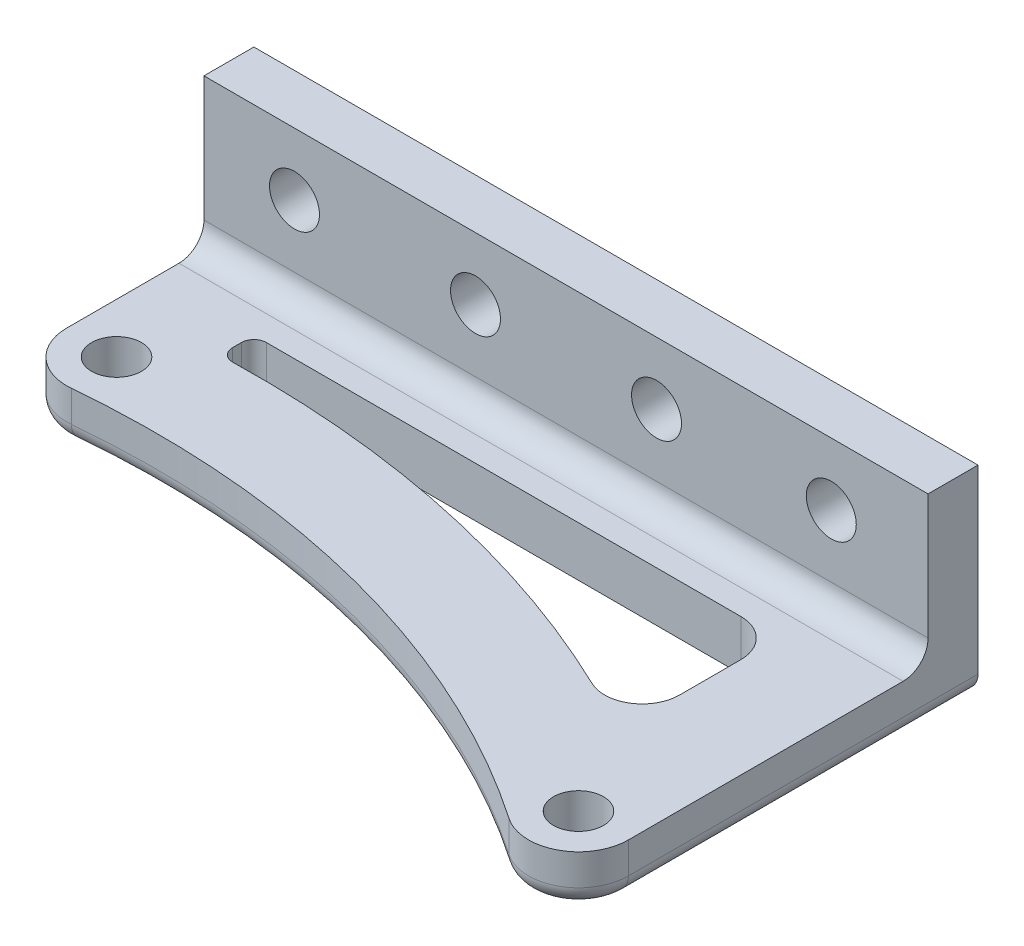
ISO-10303-21;
HEADER;
FILE_DESCRIPTION(('STEP AP214'),'2;1');
FILE_NAME('part.step','',(''),(''),'','','');
FILE_SCHEMA(('AUTOMOTIVE_DESIGN { 1 0 10303 214 1 1 1 1 }'));
ENDSEC;
DATA;
#1=APPLICATION_CONTEXT('core data for automotive mechanical design processes');
#2=APPLICATION_PROTOCOL_DEFINITION('international standard','automotive_design',2000,#1);
#3=PRODUCT_CONTEXT('',#1,'mechanical');
#4=PRODUCT('Part','Part','',(#3));
#5=PRODUCT_RELATED_PRODUCT_CATEGORY('part','',(#4));
#6=PRODUCT_DEFINITION_FORMATION('','',#4);
#7=PRODUCT_DEFINITION_CONTEXT('part definition',#1,'design');
#8=PRODUCT_DEFINITION('design','',#6,#7);
#9=PRODUCT_DEFINITION_SHAPE('','',#8);
#10=(LENGTH_UNIT() NAMED_UNIT(*) SI_UNIT(.MILLI.,.METRE.));
#11=(NAMED_UNIT(*) PLANE_ANGLE_UNIT() SI_UNIT($,.RADIAN.));
#12=(NAMED_UNIT(*) SI_UNIT($,.STERADIAN.) SOLID_ANGLE_UNIT());
#13=UNCERTAINTY_MEASURE_WITH_UNIT(LENGTH_MEASURE(1.E-05),#10,'distance_accuracy_value','');
#14=(GEOMETRIC_REPRESENTATION_CONTEXT(3) GLOBAL_UNCERTAINTY_ASSIGNED_CONTEXT((#13)) GLOBAL_UNIT_ASSIGNED_CONTEXT((#10,
#11,#12)) REPRESENTATION_CONTEXT('',''));
#15=CARTESIAN_POINT('',(0.,0.,0.));
#16=DIRECTION('',(0.,0.,1.));
#17=DIRECTION('',(1.,0.,0.));
#18=AXIS2_PLACEMENT_3D('',#15,#16,#17);
#19=CARTESIAN_POINT('',(-4.,4.,-28.));
#20=DIRECTION('',(0.,0.,1.));
#21=DIRECTION('',(1.,0.,0.));
#22=AXIS2_PLACEMENT_3D('',#19,#20,#21);
#23=PLANE('',#22);
#24=CARTESIAN_POINT('',(3.25,11.,-28.));
#25=DIRECTION('',(0.,0.,1.));
#26=DIRECTION('',(1.,0.,0.));
#27=AXIS2_PLACEMENT_3D('',#24,#25,#26);
#28=CIRCLE('',#27,2.);
#29=CARTESIAN_POINT('',(5.25,11.,-28.));
#30=VERTEX_POINT('',#29);
#31=EDGE_CURVE('E513',#30,#30,#28,.F.);
#32=ORIENTED_EDGE('',*,*,#31,.F.);
#33=EDGE_LOOP('',(#32));
#34=FACE_BOUND('',#33,.T.);
#35=CARTESIAN_POINT('',(17.75,11.,-28.));
#36=DIRECTION('',(0.,0.,1.));
#37=DIRECTION('',(1.,0.,0.));
#38=AXIS2_PLACEMENT_3D('',#35,#36,#37);
#39=CIRCLE('',#38,2.);
#40=CARTESIAN_POINT('',(19.75,11.,-28.));
#41=VERTEX_POINT('',#40);
#42=EDGE_CURVE('E199',#41,#41,#39,.F.);
#43=ORIENTED_EDGE('',*,*,#42,.F.);
#44=EDGE_LOOP('',(#43));
#45=FACE_BOUND('',#44,.T.);
#46=DIRECTION('',(0.,-1.,0.));
#47=VECTOR('',#46,1.);
#48=CARTESIAN_POINT('',(54.,4.,-28.));
#49=LINE('',#48,#47);
#50=CARTESIAN_POINT('',(54.,16.,-28.));
#51=VERTEX_POINT('',#50);
#52=CARTESIAN_POINT('',(54.,1.5,-28.));
#53=VERTEX_POINT('',#52);
#54=EDGE_CURVE('E183',#51,#53,#49,.T.);
#55=ORIENTED_EDGE('',*,*,#54,.T.);
#56=CARTESIAN_POINT('',(52.5,1.5,-28.));
#57=DIRECTION('',(0.,0.,1.));
#58=DIRECTION('',(1.,0.,0.));
#59=AXIS2_PLACEMENT_3D('',#56,#57,#58);
#60=CIRCLE('',#59,1.5);
#61=CARTESIAN_POINT('',(52.5,0.,-28.));
#62=VERTEX_POINT('',#61);
#63=EDGE_CURVE('E339',#53,#62,#60,.F.);
#64=ORIENTED_EDGE('',*,*,#63,.T.);
#65=DIRECTION('',(-1.,0.,0.));
#66=VECTOR('',#65,1.);
#67=CARTESIAN_POINT('',(-4.,0.,-28.));
#68=LINE('',#67,#66);
#69=CARTESIAN_POINT('',(-2.5,0.,-28.));
#70=VERTEX_POINT('',#69);
#71=EDGE_CURVE('E284',#62,#70,#68,.T.);
#72=ORIENTED_EDGE('',*,*,#71,.T.);
#73=CARTESIAN_POINT('',(-2.5,1.5,-28.));
#74=DIRECTION('',(0.,0.,1.));
#75=DIRECTION('',(1.,0.,0.));
#76=AXIS2_PLACEMENT_3D('',#73,#74,#75);
#77=CIRCLE('',#76,1.5);
#78=CARTESIAN_POINT('',(-4.,1.5,-28.));
#79=VERTEX_POINT('',#78);
#80=EDGE_CURVE('E181',#70,#79,#77,.F.);
#81=ORIENTED_EDGE('',*,*,#80,.T.);
#82=DIRECTION('',(0.,-1.,0.));
#83=VECTOR('',#82,1.);
#84=CARTESIAN_POINT('',(-4.,4.,-28.));
#85=LINE('',#84,#83);
#86=CARTESIAN_POINT('',(-4.,16.,-28.));
#87=VERTEX_POINT('',#86);
#88=EDGE_CURVE('E174',#87,#79,#85,.T.);
#89=ORIENTED_EDGE('',*,*,#88,.F.);
#90=DIRECTION('',(-1.,0.,0.));
#91=VECTOR('',#90,1.);
#92=CARTESIAN_POINT('',(54.,16.,-28.));
#93=LINE('',#92,#91);
#94=EDGE_CURVE('E179',#51,#87,#93,.T.);
#95=ORIENTED_EDGE('',*,*,#94,.F.);
#96=EDGE_LOOP('',(#55,#64,#72,#81,#89,#95));
#97=FACE_BOUND('',#96,.T.);
#98=CARTESIAN_POINT('',(32.25,11.,-28.));
#99=DIRECTION('',(0.,0.,1.));
#100=DIRECTION('',(1.,0.,0.));
#101=AXIS2_PLACEMENT_3D('',#98,#99,#100);
#102=CIRCLE('',#101,2.);
#103=CARTESIAN_POINT('',(34.25,11.,-28.));
#104=VERTEX_POINT('',#103);
#105=EDGE_CURVE('E498',#104,#104,#102,.T.);
#106=ORIENTED_EDGE('',*,*,#105,.T.);
#107=EDGE_LOOP('',(#106));
#108=FACE_BOUND('',#107,.T.);
#109=CARTESIAN_POINT('',(46.25,11.,-28.));
#110=DIRECTION('',(0.,0.,1.));
#111=DIRECTION('',(1.,0.,0.));
#112=AXIS2_PLACEMENT_3D('',#109,#110,#111);
#113=CIRCLE('',#112,2.);
#114=CARTESIAN_POINT('',(48.25,11.,-28.));
#115=VERTEX_POINT('',#114);
#116=EDGE_CURVE('E507',#115,#115,#113,.T.);
#117=ORIENTED_EDGE('',*,*,#116,.T.);
#118=EDGE_LOOP('',(#117));
#119=FACE_BOUND('',#118,.T.);
#120=ADVANCED_FACE('F38',(#34,#45,#97,#108,#119),#23,.F.);
#121=CARTESIAN_POINT('',(-4.,16.,-24.));
#122=DIRECTION('',(0.,0.,-1.));
#123=DIRECTION('',(-1.,0.,0.));
#124=AXIS2_PLACEMENT_3D('',#121,#122,#123);
#125=PLANE('',#124);
#126=CARTESIAN_POINT('',(3.25,11.,-24.));
#127=DIRECTION('',(0.,0.,1.));
#128=DIRECTION('',(1.,0.,0.));
#129=AXIS2_PLACEMENT_3D('',#126,#127,#128);
#130=CIRCLE('',#129,2.);
#131=CARTESIAN_POINT('',(5.25,11.,-24.));
#132=VERTEX_POINT('',#131);
#133=EDGE_CURVE('E510',#132,#132,#130,.T.);
#134=ORIENTED_EDGE('',*,*,#133,.F.);
#135=EDGE_LOOP('',(#134));
#136=FACE_BOUND('',#135,.T.);
#137=CARTESIAN_POINT('',(17.75,11.,-24.));
#138=DIRECTION('',(0.,0.,1.));
#139=DIRECTION('',(1.,0.,0.));
#140=AXIS2_PLACEMENT_3D('',#137,#138,#139);
#141=CIRCLE('',#140,2.);
#142=CARTESIAN_POINT('',(19.75,11.,-24.));
#143=VERTEX_POINT('',#142);
#144=EDGE_CURVE('E202',#143,#143,#141,.T.);
#145=ORIENTED_EDGE('',*,*,#144,.F.);
#146=EDGE_LOOP('',(#145));
#147=FACE_BOUND('',#146,.T.);
#148=DIRECTION('',(0.,-1.,0.));
#149=VECTOR('',#148,1.);
#150=CARTESIAN_POINT('',(-4.,16.,-24.));
#151=LINE('',#150,#149);
#152=CARTESIAN_POINT('',(-4.,16.,-24.));
#153=VERTEX_POINT('',#152);
#154=CARTESIAN_POINT('',(-4.,6.,-24.));
#155=VERTEX_POINT('',#154);
#156=EDGE_CURVE('E190',#153,#155,#151,.T.);
#157=ORIENTED_EDGE('',*,*,#156,.T.);
#158=DIRECTION('',(1.,0.,0.));
#159=VECTOR('',#158,1.);
#160=CARTESIAN_POINT('',(-4.,6.,-24.));
#161=LINE('',#160,#159);
#162=CARTESIAN_POINT('',(54.,6.,-24.));
#163=VERTEX_POINT('',#162);
#164=EDGE_CURVE('E310',#155,#163,#161,.T.);
#165=ORIENTED_EDGE('',*,*,#164,.T.);
#166=DIRECTION('',(0.,-1.,0.));
#167=VECTOR('',#166,1.);
#168=CARTESIAN_POINT('',(54.,16.,-24.));
#169=LINE('',#168,#167);
#170=CARTESIAN_POINT('',(54.,16.,-24.));
#171=VERTEX_POINT('',#170);
#172=EDGE_CURVE('E208',#171,#163,#169,.T.);
#173=ORIENTED_EDGE('',*,*,#172,.F.);
#174=DIRECTION('',(1.,0.,0.));
#175=VECTOR('',#174,1.);
#176=CARTESIAN_POINT('',(-4.,16.,-24.));
#177=LINE('',#176,#175);
#178=EDGE_CURVE('E193',#153,#171,#177,.T.);
#179=ORIENTED_EDGE('',*,*,#178,.F.);
#180=EDGE_LOOP('',(#157,#165,#173,#179));
#181=FACE_BOUND('',#180,.T.);
#182=CARTESIAN_POINT('',(32.25,11.,-24.));
#183=DIRECTION('',(0.,0.,1.));
#184=DIRECTION('',(1.,0.,0.));
#185=AXIS2_PLACEMENT_3D('',#182,#183,#184);
#186=CIRCLE('',#185,2.);
#187=CARTESIAN_POINT('',(34.25,11.,-24.));
#188=VERTEX_POINT('',#187);
#189=EDGE_CURVE('E501',#188,#188,#186,.F.);
#190=ORIENTED_EDGE('',*,*,#189,.T.);
#191=EDGE_LOOP('',(#190));
#192=FACE_BOUND('',#191,.T.);
#193=CARTESIAN_POINT('',(46.25,11.,-24.));
#194=DIRECTION('',(0.,0.,1.));
#195=DIRECTION('',(1.,0.,0.));
#196=AXIS2_PLACEMENT_3D('',#193,#194,#195);
#197=CIRCLE('',#196,2.);
#198=CARTESIAN_POINT('',(48.25,11.,-24.));
#199=VERTEX_POINT('',#198);
#200=EDGE_CURVE('E504',#199,#199,#197,.F.);
#201=ORIENTED_EDGE('',*,*,#200,.T.);
#202=EDGE_LOOP('',(#201));
#203=FACE_BOUND('',#202,.T.);
#204=ADVANCED_FACE('F391',(#136,#147,#181,#192,#203),#125,.F.);
#205=CARTESIAN_POINT('',(0.,1.5,-13.));
#206=DIRECTION('',(0.,1.,0.));
#207=DIRECTION('',(0.,0.,1.));
#208=AXIS2_PLACEMENT_3D('',#205,#206,#207);
#209=TOROIDAL_SURFACE('',#208,2.5,1.5);
#210=CARTESIAN_POINT('',(-2.5,1.5,-13.));
#211=DIRECTION('',(0.,0.,-1.));
#212=DIRECTION('',(-1.,0.,0.));
#213=AXIS2_PLACEMENT_3D('',#210,#211,#212);
#214=CIRCLE('',#213,1.5);
#215=CARTESIAN_POINT('',(-2.5,0.,-13.));
#216=VERTEX_POINT('',#215);
#217=CARTESIAN_POINT('',(-4.,1.5,-13.));
#218=VERTEX_POINT('',#217);
#219=EDGE_CURVE('E11',#216,#218,#214,.T.);
#220=ORIENTED_EDGE('',*,*,#219,.F.);
#221=CARTESIAN_POINT('',(0.,0.,-13.));
#222=DIRECTION('',(0.,1.,0.));
#223=DIRECTION('',(0.,0.,1.));
#224=AXIS2_PLACEMENT_3D('',#221,#222,#223);
#225=CIRCLE('',#224,2.5);
#226=CARTESIAN_POINT('',(0.225630994390622,0.,-10.5102026880948));
#227=VERTEX_POINT('',#226);
#228=EDGE_CURVE('E323',#227,#216,#225,.F.);
#229=ORIENTED_EDGE('',*,*,#228,.F.);
#230=CARTESIAN_POINT('',(0.225630994390629,1.5,-10.5102026880948));
#231=DIRECTION('',(-0.995918924762076,0.,0.090252397756244));
#232=DIRECTION('',(0.090252397756244,0.,0.995918924762076));
#233=AXIS2_PLACEMENT_3D('',#230,#231,#232);
#234=CIRCLE('',#233,1.5);
#235=CARTESIAN_POINT('',(0.361009591024995,1.5,-9.0163243009517));
#236=VERTEX_POINT('',#235);
#237=EDGE_CURVE('E46',#227,#236,#234,.T.);
#238=ORIENTED_EDGE('',*,*,#237,.T.);
#239=CARTESIAN_POINT('',(0.,1.5,-13.));
#240=DIRECTION('',(0.,1.,0.));
#241=DIRECTION('',(0.,0.,1.));
#242=AXIS2_PLACEMENT_3D('',#239,#240,#241);
#243=CIRCLE('',#242,4.);
#244=EDGE_CURVE('E347',#218,#236,#243,.T.);
#245=ORIENTED_EDGE('',*,*,#244,.F.);
#246=EDGE_LOOP('',(#220,#229,#238,#245));
#247=FACE_BOUND('',#246,.T.);
#248=ADVANCED_FACE('F380',(#247),#209,.T.);
#249=CARTESIAN_POINT('',(6.89832871152092,1.5,63.1218126479964));
#250=DIRECTION('',(0.,1.,0.));
#251=DIRECTION('',(0.,0.,1.));
#252=AXIS2_PLACEMENT_3D('',#249,#250,#251);
#253=TOROIDAL_SURFACE('',#252,73.9337445100583,1.5);
#254=ORIENTED_EDGE('',*,*,#237,.F.);
#255=CARTESIAN_POINT('',(6.89832871152092,0.,63.1218126479964));
#256=DIRECTION('',(0.,1.,0.));
#257=DIRECTION('',(0.,0.,1.));
#258=AXIS2_PLACEMENT_3D('',#255,#256,#257);
#259=CIRCLE('',#258,73.9337445100583);
#260=CARTESIAN_POINT('',(48.5902276682648,0.,2.06459244711248));
#261=VERTEX_POINT('',#260);
#262=EDGE_CURVE('E326',#261,#227,#259,.T.);
#263=ORIENTED_EDGE('',*,*,#262,.F.);
#264=CARTESIAN_POINT('',(48.5902276682648,1.5,2.06459244711248));
#265=DIRECTION('',(-0.825836978844991,0.,-0.563908932694082));
#266=DIRECTION('',(-0.563908932694082,0.,0.825836978844991));
#267=AXIS2_PLACEMENT_3D('',#264,#265,#266);
#268=CIRCLE('',#267,1.5);
#269=CARTESIAN_POINT('',(47.7443642692237,1.5,3.30334791537996));
#270=VERTEX_POINT('',#269);
#271=EDGE_CURVE('E353',#261,#270,#268,.T.);
#272=ORIENTED_EDGE('',*,*,#271,.T.);
#273=CARTESIAN_POINT('',(6.89832871152092,1.5,63.1218126479964));
#274=DIRECTION('',(0.,1.,0.));
#275=DIRECTION('',(0.,0.,1.));
#276=AXIS2_PLACEMENT_3D('',#273,#274,#275);
#277=CIRCLE('',#276,72.4337445100582);
#278=EDGE_CURVE('E344',#236,#270,#277,.F.);
#279=ORIENTED_EDGE('',*,*,#278,.F.);
#280=EDGE_LOOP('',(#254,#263,#272,#279));
#281=FACE_BOUND('',#280,.T.);
#282=ADVANCED_FACE('F357',(#281),#253,.T.);
#283=CARTESIAN_POINT('',(50.,1.5,0.));
#284=DIRECTION('',(0.,1.,0.));
#285=DIRECTION('',(0.,0.,1.));
#286=AXIS2_PLACEMENT_3D('',#283,#284,#285);
#287=TOROIDAL_SURFACE('',#286,2.50000000000001,1.5);
#288=ORIENTED_EDGE('',*,*,#271,.F.);
#289=CARTESIAN_POINT('',(50.,0.,0.));
#290=DIRECTION('',(0.,1.,0.));
#291=DIRECTION('',(0.,0.,1.));
#292=AXIS2_PLACEMENT_3D('',#289,#290,#291);
#293=CIRCLE('',#292,2.50000000000001);
#294=CARTESIAN_POINT('',(52.5,0.,0.));
#295=VERTEX_POINT('',#294);
#296=EDGE_CURVE('E329',#295,#261,#293,.F.);
#297=ORIENTED_EDGE('',*,*,#296,.F.);
#298=CARTESIAN_POINT('',(52.5,1.5,0.));
#299=DIRECTION('',(0.,0.,1.));
#300=DIRECTION('',(1.,0.,0.));
#301=AXIS2_PLACEMENT_3D('',#298,#299,#300);
#302=CIRCLE('',#301,1.5);
#303=CARTESIAN_POINT('',(54.,1.5,0.));
#304=VERTEX_POINT('',#303);
#305=EDGE_CURVE('E351',#295,#304,#302,.T.);
#306=ORIENTED_EDGE('',*,*,#305,.T.);
#307=CARTESIAN_POINT('',(50.,1.5,0.));
#308=DIRECTION('',(0.,1.,0.));
#309=DIRECTION('',(0.,0.,1.));
#310=AXIS2_PLACEMENT_3D('',#307,#308,#309);
#311=CIRCLE('',#310,4.00000000000001);
#312=EDGE_CURVE('E341',#270,#304,#311,.T.);
#313=ORIENTED_EDGE('',*,*,#312,.F.);
#314=EDGE_LOOP('',(#288,#297,#306,#313));
#315=FACE_BOUND('',#314,.T.);
#316=ADVANCED_FACE('F366',(#315),#287,.T.);
#317=CARTESIAN_POINT('',(52.5,1.5,-13.));
#318=DIRECTION('',(0.,0.,1.));
#319=DIRECTION('',(1.,0.,0.));
#320=AXIS2_PLACEMENT_3D('',#317,#318,#319);
#321=CYLINDRICAL_SURFACE('',#320,1.5);
#322=ORIENTED_EDGE('',*,*,#305,.F.);
#323=DIRECTION('',(0.,0.,1.));
#324=VECTOR('',#323,1.);
#325=CARTESIAN_POINT('',(52.5,0.,-13.));
#326=LINE('',#325,#324);
#327=EDGE_CURVE('E332',#62,#295,#326,.T.);
#328=ORIENTED_EDGE('',*,*,#327,.F.);
#329=ORIENTED_EDGE('',*,*,#63,.F.);
#330=DIRECTION('',(0.,0.,1.));
#331=VECTOR('',#330,1.);
#332=CARTESIAN_POINT('',(54.,1.5,-28.));
#333=LINE('',#332,#331);
#334=EDGE_CURVE('E335',#304,#53,#333,.F.);
#335=ORIENTED_EDGE('',*,*,#334,.F.);
#336=EDGE_LOOP('',(#322,#328,#329,#335));
#337=FACE_BOUND('',#336,.T.);
#338=ADVANCED_FACE('F397',(#337),#321,.T.);
#339=CARTESIAN_POINT('',(-2.5,1.5,-13.));
#340=DIRECTION('',(0.,0.,-1.));
#341=DIRECTION('',(-1.,0.,0.));
#342=AXIS2_PLACEMENT_3D('',#339,#340,#341);
#343=CYLINDRICAL_SURFACE('',#342,1.5);
#344=DIRECTION('',(0.,0.,-1.));
#345=VECTOR('',#344,1.);
#346=CARTESIAN_POINT('',(-2.5,0.,-13.));
#347=LINE('',#346,#345);
#348=EDGE_CURVE('E320',#216,#70,#347,.T.);
#349=ORIENTED_EDGE('',*,*,#348,.F.);
#350=ORIENTED_EDGE('',*,*,#219,.T.);
#351=DIRECTION('',(0.,0.,-1.));
#352=VECTOR('',#351,1.);
#353=CARTESIAN_POINT('',(-4.,1.5,-13.));
#354=LINE('',#353,#352);
#355=EDGE_CURVE('E349',#79,#218,#354,.F.);
#356=ORIENTED_EDGE('',*,*,#355,.F.);
#357=ORIENTED_EDGE('',*,*,#80,.F.);
#358=EDGE_LOOP('',(#349,#350,#356,#357));
#359=FACE_BOUND('',#358,.T.);
#360=ADVANCED_FACE('F40',(#359),#343,.T.);
#361=CARTESIAN_POINT('',(-4.,6.,-22.));
#362=DIRECTION('',(1.,0.,0.));
#363=DIRECTION('',(0.,0.,-1.));
#364=AXIS2_PLACEMENT_3D('',#361,#362,#363);
#365=CYLINDRICAL_SURFACE('',#364,2.);
#366=ORIENTED_EDGE('',*,*,#164,.F.);
#367=CARTESIAN_POINT('',(-4.,6.,-22.));
#368=DIRECTION('',(1.,0.,0.));
#369=DIRECTION('',(0.,0.,-1.));
#370=AXIS2_PLACEMENT_3D('',#367,#368,#369);
#371=CIRCLE('',#370,2.);
#372=CARTESIAN_POINT('',(-4.,4.,-22.));
#373=VERTEX_POINT('',#372);
#374=EDGE_CURVE('E316',#155,#373,#371,.F.);
#375=ORIENTED_EDGE('',*,*,#374,.T.);
#376=DIRECTION('',(1.,0.,0.));
#377=VECTOR('',#376,1.);
#378=CARTESIAN_POINT('',(0.,4.,-22.));
#379=LINE('',#378,#377);
#380=CARTESIAN_POINT('',(54.,4.,-22.));
#381=VERTEX_POINT('',#380);
#382=EDGE_CURVE('E313',#381,#373,#379,.F.);
#383=ORIENTED_EDGE('',*,*,#382,.F.);
#384=CARTESIAN_POINT('',(54.,6.,-22.));
#385=DIRECTION('',(-1.,0.,0.));
#386=DIRECTION('',(0.,0.,1.));
#387=AXIS2_PLACEMENT_3D('',#384,#385,#386);
#388=CIRCLE('',#387,2.);
#389=EDGE_CURVE('E318',#381,#163,#388,.F.);
#390=ORIENTED_EDGE('',*,*,#389,.T.);
#391=EDGE_LOOP('',(#366,#375,#383,#390));
#392=FACE_BOUND('',#391,.T.);
#393=ADVANCED_FACE('F388',(#392),#365,.F.);
#394=CARTESIAN_POINT('',(0.,4.,-13.));
#395=DIRECTION('',(0.,1.,0.));
#396=DIRECTION('',(0.,0.,1.));
#397=AXIS2_PLACEMENT_3D('',#394,#395,#396);
#398=PLANE('',#397);
#399=DIRECTION('',(0.,0.,-1.));
#400=VECTOR('',#399,1.);
#401=CARTESIAN_POINT('',(54.,4.,-28.));
#402=LINE('',#401,#400);
#403=CARTESIAN_POINT('',(54.,4.,0.));
#404=VERTEX_POINT('',#403);
#405=EDGE_CURVE('E292',#404,#381,#402,.T.);
#406=ORIENTED_EDGE('',*,*,#405,.T.);
#407=ORIENTED_EDGE('',*,*,#382,.T.);
#408=DIRECTION('',(0.,0.,1.));
#409=VECTOR('',#408,1.);
#410=CARTESIAN_POINT('',(-4.,4.,-13.));
#411=LINE('',#410,#409);
#412=CARTESIAN_POINT('',(-4.,4.,-13.));
#413=VERTEX_POINT('',#412);
#414=EDGE_CURVE('E295',#373,#413,#411,.T.);
#415=ORIENTED_EDGE('',*,*,#414,.T.);
#416=CARTESIAN_POINT('',(0.,4.,-13.));
#417=DIRECTION('',(0.,1.,0.));
#418=DIRECTION('',(0.,0.,1.));
#419=AXIS2_PLACEMENT_3D('',#416,#417,#418);
#420=CIRCLE('',#419,4.);
#421=CARTESIAN_POINT('',(0.361009591024995,4.,-9.0163243009517));
#422=VERTEX_POINT('',#421);
#423=EDGE_CURVE('E285',#413,#422,#420,.T.);
#424=ORIENTED_EDGE('',*,*,#423,.T.);
#425=CARTESIAN_POINT('',(6.89832871152092,4.,63.1218126479964));
#426=DIRECTION('',(0.,-1.,0.));
#427=DIRECTION('',(0.,0.,1.));
#428=AXIS2_PLACEMENT_3D('',#425,#426,#427);
#429=CIRCLE('',#428,72.4337445100582);
#430=CARTESIAN_POINT('',(47.7443642692237,4.,3.30334791537996));
#431=VERTEX_POINT('',#430);
#432=EDGE_CURVE('E288',#422,#431,#429,.T.);
#433=ORIENTED_EDGE('',*,*,#432,.T.);
#434=CARTESIAN_POINT('',(50.,4.,0.));
#435=DIRECTION('',(0.,1.,0.));
#436=DIRECTION('',(0.,0.,1.));
#437=AXIS2_PLACEMENT_3D('',#434,#435,#436);
#438=CIRCLE('',#437,4.00000000000001);
#439=EDGE_CURVE('E290',#431,#404,#438,.T.);
#440=ORIENTED_EDGE('',*,*,#439,.T.);
#441=EDGE_LOOP('',(#406,#407,#415,#424,#433,#440));
#442=FACE_BOUND('',#441,.T.);
#443=CARTESIAN_POINT('',(0.,4.,-13.));
#444=DIRECTION('',(0.,1.,0.));
#445=DIRECTION('',(0.,0.,1.));
#446=AXIS2_PLACEMENT_3D('',#443,#444,#445);
#447=CIRCLE('',#446,2.);
#448=CARTESIAN_POINT('',(0.,4.,-11.));
#449=VERTEX_POINT('',#448);
#450=EDGE_CURVE('E219',#449,#449,#447,.T.);
#451=ORIENTED_EDGE('',*,*,#450,.F.);
#452=EDGE_LOOP('',(#451));
#453=FACE_BOUND('',#452,.T.);
#454=CARTESIAN_POINT('',(43.,4.,-12.0969287210818));
#455=DIRECTION('',(0.,1.,0.));
#456=DIRECTION('',(0.,0.,-1.));
#457=AXIS2_PLACEMENT_3D('',#454,#455,#456);
#458=CIRCLE('',#457,3.00000000000001);
#459=CARTESIAN_POINT('',(41.7019039538327,4.,-9.3923129156623));
#460=VERTEX_POINT('',#459);
#461=CARTESIAN_POINT('',(46.,4.,-12.0969287210818));
#462=VERTEX_POINT('',#461);
#463=EDGE_CURVE('E227',#460,#462,#458,.T.);
#464=ORIENTED_EDGE('',*,*,#463,.F.);
#465=CARTESIAN_POINT('',(6.89832871152092,4.,63.1218126479964));
#466=DIRECTION('',(0.,-1.,0.));
#467=DIRECTION('',(0.,0.,1.));
#468=AXIS2_PLACEMENT_3D('',#465,#466,#467);
#469=CIRCLE('',#468,80.4337445100582);
#470=CARTESIAN_POINT('',(5.02331132779098,4.,-17.2900743197898));
#471=VERTEX_POINT('',#470);
#472=EDGE_CURVE('E225',#471,#460,#469,.T.);
#473=ORIENTED_EDGE('',*,*,#472,.F.);
#474=CARTESIAN_POINT('',(5.,4.,-18.2898025738652));
#475=DIRECTION('',(0.,1.,0.));
#476=DIRECTION('',(0.,0.,-1.));
#477=AXIS2_PLACEMENT_3D('',#474,#475,#476);
#478=CIRCLE('',#477,1.);
#479=CARTESIAN_POINT('',(4.,4.,-18.2898025738652));
#480=VERTEX_POINT('',#479);
#481=EDGE_CURVE('E241',#480,#471,#478,.T.);
#482=ORIENTED_EDGE('',*,*,#481,.F.);
#483=DIRECTION('',(0.,0.,1.));
#484=VECTOR('',#483,1.);
#485=CARTESIAN_POINT('',(4.,4.,-18.2898025738652));
#486=LINE('',#485,#484);
#487=CARTESIAN_POINT('',(4.,4.,-19.));
#488=VERTEX_POINT('',#487);
#489=EDGE_CURVE('E238',#488,#480,#486,.T.);
#490=ORIENTED_EDGE('',*,*,#489,.F.);
#491=CARTESIAN_POINT('',(5.,4.,-19.));
#492=DIRECTION('',(0.,1.,0.));
#493=DIRECTION('',(0.,0.,1.));
#494=AXIS2_PLACEMENT_3D('',#491,#492,#493);
#495=CIRCLE('',#494,1.);
#496=CARTESIAN_POINT('',(5.00000000000001,4.,-20.));
#497=VERTEX_POINT('',#496);
#498=EDGE_CURVE('E236',#497,#488,#495,.T.);
#499=ORIENTED_EDGE('',*,*,#498,.F.);
#500=DIRECTION('',(-1.,0.,0.));
#501=VECTOR('',#500,1.);
#502=CARTESIAN_POINT('',(25.,4.,-20.));
#503=LINE('',#502,#501);
#504=CARTESIAN_POINT('',(43.,4.,-20.));
#505=VERTEX_POINT('',#504);
#506=EDGE_CURVE('E234',#505,#497,#503,.T.);
#507=ORIENTED_EDGE('',*,*,#506,.F.);
#508=CARTESIAN_POINT('',(43.,4.,-17.));
#509=DIRECTION('',(0.,1.,0.));
#510=DIRECTION('',(0.,0.,1.));
#511=AXIS2_PLACEMENT_3D('',#508,#509,#510);
#512=CIRCLE('',#511,3.);
#513=CARTESIAN_POINT('',(46.,4.,-17.));
#514=VERTEX_POINT('',#513);
#515=EDGE_CURVE('E232',#514,#505,#512,.T.);
#516=ORIENTED_EDGE('',*,*,#515,.F.);
#517=DIRECTION('',(0.,0.,-1.));
#518=VECTOR('',#517,1.);
#519=CARTESIAN_POINT('',(46.,4.,-12.0969287210818));
#520=LINE('',#519,#518);
#521=EDGE_CURVE('E230',#462,#514,#520,.T.);
#522=ORIENTED_EDGE('',*,*,#521,.F.);
#523=EDGE_LOOP('',(#464,#473,#482,#490,#499,#507,#516,#522));
#524=FACE_BOUND('',#523,.T.);
#525=CARTESIAN_POINT('',(50.,4.,0.));
#526=DIRECTION('',(0.,1.,0.));
#527=DIRECTION('',(0.,0.,1.));
#528=AXIS2_PLACEMENT_3D('',#525,#526,#527);
#529=CIRCLE('',#528,2.);
#530=CARTESIAN_POINT('',(50.,4.,2.));
#531=VERTEX_POINT('',#530);
#532=EDGE_CURVE('E213',#531,#531,#529,.T.);
#533=ORIENTED_EDGE('',*,*,#532,.F.);
#534=EDGE_LOOP('',(#533));
#535=FACE_BOUND('',#534,.T.);
#536=ADVANCED_FACE('F373',(#442,#453,#524,#535),#398,.T.);
#537=CARTESIAN_POINT('',(0.,0.,-13.));
#538=DIRECTION('',(0.,1.,0.));
#539=DIRECTION('',(0.,0.,1.));
#540=AXIS2_PLACEMENT_3D('',#537,#538,#539);
#541=PLANE('',#540);
#542=ORIENTED_EDGE('',*,*,#71,.F.);
#543=ORIENTED_EDGE('',*,*,#327,.T.);
#544=ORIENTED_EDGE('',*,*,#296,.T.);
#545=ORIENTED_EDGE('',*,*,#262,.T.);
#546=ORIENTED_EDGE('',*,*,#228,.T.);
#547=ORIENTED_EDGE('',*,*,#348,.T.);
#548=EDGE_LOOP('',(#542,#543,#544,#545,#546,#547));
#549=FACE_BOUND('',#548,.T.);
#550=CARTESIAN_POINT('',(6.89832871152092,0.,63.1218126479964));
#551=DIRECTION('',(0.,-1.,0.));
#552=DIRECTION('',(0.,0.,1.));
#553=AXIS2_PLACEMENT_3D('',#550,#551,#552);
#554=CIRCLE('',#553,80.4337445100582);
#555=CARTESIAN_POINT('',(5.02331132779098,0.,-17.2900743197898));
#556=VERTEX_POINT('',#555);
#557=CARTESIAN_POINT('',(41.7019039538327,0.,-9.3923129156623));
#558=VERTEX_POINT('',#557);
#559=EDGE_CURVE('E222',#556,#558,#554,.T.);
#560=ORIENTED_EDGE('',*,*,#559,.T.);
#561=CARTESIAN_POINT('',(43.,0.,-12.0969287210818));
#562=DIRECTION('',(0.,1.,0.));
#563=DIRECTION('',(0.,0.,-1.));
#564=AXIS2_PLACEMENT_3D('',#561,#562,#563);
#565=CIRCLE('',#564,3.00000000000001);
#566=CARTESIAN_POINT('',(46.,0.,-12.0969287210818));
#567=VERTEX_POINT('',#566);
#568=EDGE_CURVE('E246',#558,#567,#565,.T.);
#569=ORIENTED_EDGE('',*,*,#568,.T.);
#570=DIRECTION('',(0.,0.,-1.));
#571=VECTOR('',#570,1.);
#572=CARTESIAN_POINT('',(46.,0.,-12.0969287210818));
#573=LINE('',#572,#571);
#574=CARTESIAN_POINT('',(46.,0.,-17.));
#575=VERTEX_POINT('',#574);
#576=EDGE_CURVE('E249',#567,#575,#573,.T.);
#577=ORIENTED_EDGE('',*,*,#576,.T.);
#578=CARTESIAN_POINT('',(43.,0.,-17.));
#579=DIRECTION('',(0.,1.,0.));
#580=DIRECTION('',(0.,0.,1.));
#581=AXIS2_PLACEMENT_3D('',#578,#579,#580);
#582=CIRCLE('',#581,3.);
#583=CARTESIAN_POINT('',(43.,0.,-20.));
#584=VERTEX_POINT('',#583);
#585=EDGE_CURVE('E252',#575,#584,#582,.T.);
#586=ORIENTED_EDGE('',*,*,#585,.T.);
#587=DIRECTION('',(-1.,0.,0.));
#588=VECTOR('',#587,1.);
#589=CARTESIAN_POINT('',(25.,0.,-20.));
#590=LINE('',#589,#588);
#591=CARTESIAN_POINT('',(5.00000000000001,0.,-20.));
#592=VERTEX_POINT('',#591);
#593=EDGE_CURVE('E255',#584,#592,#590,.T.);
#594=ORIENTED_EDGE('',*,*,#593,.T.);
#595=CARTESIAN_POINT('',(5.,0.,-19.));
#596=DIRECTION('',(0.,1.,0.));
#597=DIRECTION('',(0.,0.,1.));
#598=AXIS2_PLACEMENT_3D('',#595,#596,#597);
#599=CIRCLE('',#598,1.);
#600=CARTESIAN_POINT('',(4.,0.,-19.));
#601=VERTEX_POINT('',#600);
#602=EDGE_CURVE('E258',#592,#601,#599,.T.);
#603=ORIENTED_EDGE('',*,*,#602,.T.);
#604=DIRECTION('',(0.,0.,1.));
#605=VECTOR('',#604,1.);
#606=CARTESIAN_POINT('',(4.,0.,-18.2898025738652));
#607=LINE('',#606,#605);
#608=CARTESIAN_POINT('',(4.,0.,-18.2898025738652));
#609=VERTEX_POINT('',#608);
#610=EDGE_CURVE('E261',#601,#609,#607,.T.);
#611=ORIENTED_EDGE('',*,*,#610,.T.);
#612=CARTESIAN_POINT('',(5.,0.,-18.2898025738652));
#613=DIRECTION('',(0.,1.,0.));
#614=DIRECTION('',(0.,0.,-1.));
#615=AXIS2_PLACEMENT_3D('',#612,#613,#614);
#616=CIRCLE('',#615,1.);
#617=EDGE_CURVE('E228',#609,#556,#616,.T.);
#618=ORIENTED_EDGE('',*,*,#617,.T.);
#619=EDGE_LOOP('',(#560,#569,#577,#586,#594,#603,#611,#618));
#620=FACE_BOUND('',#619,.T.);
#621=CARTESIAN_POINT('',(0.,0.,-13.));
#622=DIRECTION('',(0.,1.,0.));
#623=DIRECTION('',(0.,0.,1.));
#624=AXIS2_PLACEMENT_3D('',#621,#622,#623);
#625=CIRCLE('',#624,2.);
#626=CARTESIAN_POINT('',(0.,0.,-11.));
#627=VERTEX_POINT('',#626);
#628=EDGE_CURVE('E216',#627,#627,#625,.T.);
#629=ORIENTED_EDGE('',*,*,#628,.T.);
#630=EDGE_LOOP('',(#629));
#631=FACE_BOUND('',#630,.T.);
#632=CARTESIAN_POINT('',(50.,0.,0.));
#633=DIRECTION('',(0.,1.,0.));
#634=DIRECTION('',(0.,0.,1.));
#635=AXIS2_PLACEMENT_3D('',#632,#633,#634);
#636=CIRCLE('',#635,2.);
#637=CARTESIAN_POINT('',(50.,0.,2.));
#638=VERTEX_POINT('',#637);
#639=EDGE_CURVE('E212',#638,#638,#636,.T.);
#640=ORIENTED_EDGE('',*,*,#639,.T.);
#641=EDGE_LOOP('',(#640));
#642=FACE_BOUND('',#641,.T.);
#643=ADVANCED_FACE('F383',(#549,#620,#631,#642),#541,.F.);
#644=CARTESIAN_POINT('',(0.,4.,-13.));
#645=DIRECTION('',(0.,-1.,0.));
#646=DIRECTION('',(0.,0.,-1.));
#647=AXIS2_PLACEMENT_3D('',#644,#645,#646);
#648=CYLINDRICAL_SURFACE('',#647,4.);
#649=DIRECTION('',(0.,-1.,0.));
#650=VECTOR('',#649,1.);
#651=CARTESIAN_POINT('',(-4.,4.,-13.));
#652=LINE('',#651,#650);
#653=EDGE_CURVE('E184',#413,#218,#652,.T.);
#654=ORIENTED_EDGE('',*,*,#653,.T.);
#655=ORIENTED_EDGE('',*,*,#244,.T.);
#656=DIRECTION('',(0.,-1.,0.));
#657=VECTOR('',#656,1.);
#658=CARTESIAN_POINT('',(0.361009591024995,4.,-9.0163243009517));
#659=LINE('',#658,#657);
#660=EDGE_CURVE('E307',#422,#236,#659,.T.);
#661=ORIENTED_EDGE('',*,*,#660,.F.);
#662=ORIENTED_EDGE('',*,*,#423,.F.);
#663=EDGE_LOOP('',(#654,#655,#661,#662));
#664=FACE_BOUND('',#663,.T.);
#665=ADVANCED_FACE('F379',(#664),#648,.T.);
#666=CARTESIAN_POINT('',(6.89832871152092,4.,63.1218126479964));
#667=DIRECTION('',(0.,-1.,0.));
#668=DIRECTION('',(0.,0.,-1.));
#669=AXIS2_PLACEMENT_3D('',#666,#667,#668);
#670=CYLINDRICAL_SURFACE('',#669,72.4337445100582);
#671=ORIENTED_EDGE('',*,*,#660,.T.);
#672=ORIENTED_EDGE('',*,*,#278,.T.);
#673=DIRECTION('',(0.,-1.,0.));
#674=VECTOR('',#673,1.);
#675=CARTESIAN_POINT('',(47.7443642692237,4.,3.30334791537996));
#676=LINE('',#675,#674);
#677=EDGE_CURVE('E304',#431,#270,#676,.T.);
#678=ORIENTED_EDGE('',*,*,#677,.F.);
#679=ORIENTED_EDGE('',*,*,#432,.F.);
#680=EDGE_LOOP('',(#671,#672,#678,#679));
#681=FACE_BOUND('',#680,.T.);
#682=ADVANCED_FACE('F363',(#681),#670,.F.);
#683=CARTESIAN_POINT('',(50.,4.,0.));
#684=DIRECTION('',(0.,-1.,0.));
#685=DIRECTION('',(0.,0.,-1.));
#686=AXIS2_PLACEMENT_3D('',#683,#684,#685);
#687=CYLINDRICAL_SURFACE('',#686,4.00000000000001);
#688=ORIENTED_EDGE('',*,*,#677,.T.);
#689=ORIENTED_EDGE('',*,*,#312,.T.);
#690=DIRECTION('',(0.,-1.,0.));
#691=VECTOR('',#690,1.);
#692=CARTESIAN_POINT('',(54.,4.,0.));
#693=LINE('',#692,#691);
#694=EDGE_CURVE('E301',#404,#304,#693,.T.);
#695=ORIENTED_EDGE('',*,*,#694,.F.);
#696=ORIENTED_EDGE('',*,*,#439,.F.);
#697=EDGE_LOOP('',(#688,#689,#695,#696));
#698=FACE_BOUND('',#697,.T.);
#699=ADVANCED_FACE('F370',(#698),#687,.T.);
#700=CARTESIAN_POINT('',(54.,4.,-28.));
#701=DIRECTION('',(-1.,0.,0.));
#702=DIRECTION('',(0.,0.,1.));
#703=AXIS2_PLACEMENT_3D('',#700,#701,#702);
#704=PLANE('',#703);
#705=ORIENTED_EDGE('',*,*,#694,.T.);
#706=ORIENTED_EDGE('',*,*,#334,.T.);
#707=ORIENTED_EDGE('',*,*,#54,.F.);
#708=DIRECTION('',(0.,0.,-1.));
#709=VECTOR('',#708,1.);
#710=CARTESIAN_POINT('',(54.,16.,-24.));
#711=LINE('',#710,#709);
#712=EDGE_CURVE('E198',#171,#51,#711,.T.);
#713=ORIENTED_EDGE('',*,*,#712,.F.);
#714=ORIENTED_EDGE('',*,*,#172,.T.);
#715=ORIENTED_EDGE('',*,*,#389,.F.);
#716=ORIENTED_EDGE('',*,*,#405,.F.);
#717=EDGE_LOOP('',(#705,#706,#707,#713,#714,#715,#716));
#718=FACE_BOUND('',#717,.T.);
#719=ADVANCED_FACE('F394',(#718),#704,.F.);
#720=CARTESIAN_POINT('',(-4.,4.,-13.));
#721=DIRECTION('',(1.,0.,0.));
#722=DIRECTION('',(0.,0.,-1.));
#723=AXIS2_PLACEMENT_3D('',#720,#721,#722);
#724=PLANE('',#723);
#725=ORIENTED_EDGE('',*,*,#88,.T.);
#726=ORIENTED_EDGE('',*,*,#355,.T.);
#727=ORIENTED_EDGE('',*,*,#653,.F.);
#728=ORIENTED_EDGE('',*,*,#414,.F.);
#729=ORIENTED_EDGE('',*,*,#374,.F.);
#730=ORIENTED_EDGE('',*,*,#156,.F.);
#731=DIRECTION('',(0.,0.,1.));
#732=VECTOR('',#731,1.);
#733=CARTESIAN_POINT('',(-4.,16.,-28.));
#734=LINE('',#733,#732);
#735=EDGE_CURVE('E187',#87,#153,#734,.T.);
#736=ORIENTED_EDGE('',*,*,#735,.F.);
#737=EDGE_LOOP('',(#725,#726,#727,#728,#729,#730,#736));
#738=FACE_BOUND('',#737,.T.);
#739=ADVANCED_FACE('F188',(#738),#724,.F.);
#740=CARTESIAN_POINT('',(6.89832871152092,4.,63.1218126479964));
#741=DIRECTION('',(0.,-1.,0.));
#742=DIRECTION('',(0.,0.,-1.));
#743=AXIS2_PLACEMENT_3D('',#740,#741,#742);
#744=CYLINDRICAL_SURFACE('',#743,80.4337445100582);
#745=ORIENTED_EDGE('',*,*,#559,.F.);
#746=DIRECTION('',(0.,-1.,0.));
#747=VECTOR('',#746,1.);
#748=CARTESIAN_POINT('',(5.02331132779098,4.,-17.2900743197898));
#749=LINE('',#748,#747);
#750=EDGE_CURVE('E243',#471,#556,#749,.T.);
#751=ORIENTED_EDGE('',*,*,#750,.F.);
#752=ORIENTED_EDGE('',*,*,#472,.T.);
#753=DIRECTION('',(0.,-1.,0.));
#754=VECTOR('',#753,1.);
#755=CARTESIAN_POINT('',(41.7019039538327,4.,-9.3923129156623));
#756=LINE('',#755,#754);
#757=EDGE_CURVE('E281',#460,#558,#756,.T.);
#758=ORIENTED_EDGE('',*,*,#757,.T.);
#759=EDGE_LOOP('',(#745,#751,#752,#758));
#760=FACE_BOUND('',#759,.T.);
#761=ADVANCED_FACE('F436',(#760),#744,.T.);
#762=CARTESIAN_POINT('',(43.,4.,-12.0969287210818));
#763=DIRECTION('',(0.,-1.,0.));
#764=DIRECTION('',(0.,0.,-1.));
#765=AXIS2_PLACEMENT_3D('',#762,#763,#764);
#766=CYLINDRICAL_SURFACE('',#765,3.00000000000001);
#767=ORIENTED_EDGE('',*,*,#568,.F.);
#768=ORIENTED_EDGE('',*,*,#757,.F.);
#769=ORIENTED_EDGE('',*,*,#463,.T.);
#770=DIRECTION('',(0.,-1.,0.));
#771=VECTOR('',#770,1.);
#772=CARTESIAN_POINT('',(46.,4.,-12.0969287210818));
#773=LINE('',#772,#771);
#774=EDGE_CURVE('E279',#462,#567,#773,.T.);
#775=ORIENTED_EDGE('',*,*,#774,.T.);
#776=EDGE_LOOP('',(#767,#768,#769,#775));
#777=FACE_BOUND('',#776,.T.);
#778=ADVANCED_FACE('F439',(#777),#766,.F.);
#779=CARTESIAN_POINT('',(46.,4.,-12.0969287210818));
#780=DIRECTION('',(-1.,0.,0.));
#781=DIRECTION('',(0.,0.,1.));
#782=AXIS2_PLACEMENT_3D('',#779,#780,#781);
#783=PLANE('',#782);
#784=ORIENTED_EDGE('',*,*,#576,.F.);
#785=ORIENTED_EDGE('',*,*,#774,.F.);
#786=ORIENTED_EDGE('',*,*,#521,.T.);
#787=DIRECTION('',(0.,-1.,0.));
#788=VECTOR('',#787,1.);
#789=CARTESIAN_POINT('',(46.,4.,-17.));
#790=LINE('',#789,#788);
#791=EDGE_CURVE('E277',#514,#575,#790,.T.);
#792=ORIENTED_EDGE('',*,*,#791,.T.);
#793=EDGE_LOOP('',(#784,#785,#786,#792));
#794=FACE_BOUND('',#793,.T.);
#795=ADVANCED_FACE('F443',(#794),#783,.T.);
#796=CARTESIAN_POINT('',(43.,4.,-17.));
#797=DIRECTION('',(0.,-1.,0.));
#798=DIRECTION('',(0.,0.,-1.));
#799=AXIS2_PLACEMENT_3D('',#796,#797,#798);
#800=CYLINDRICAL_SURFACE('',#799,3.);
#801=ORIENTED_EDGE('',*,*,#585,.F.);
#802=ORIENTED_EDGE('',*,*,#791,.F.);
#803=ORIENTED_EDGE('',*,*,#515,.T.);
#804=DIRECTION('',(0.,-1.,0.));
#805=VECTOR('',#804,1.);
#806=CARTESIAN_POINT('',(43.,4.,-20.));
#807=LINE('',#806,#805);
#808=EDGE_CURVE('E274',#505,#584,#807,.T.);
#809=ORIENTED_EDGE('',*,*,#808,.T.);
#810=EDGE_LOOP('',(#801,#802,#803,#809));
#811=FACE_BOUND('',#810,.T.);
#812=ADVANCED_FACE('F447',(#811),#800,.F.);
#813=CARTESIAN_POINT('',(25.,4.,-20.));
#814=DIRECTION('',(0.,0.,1.));
#815=DIRECTION('',(1.,0.,0.));
#816=AXIS2_PLACEMENT_3D('',#813,#814,#815);
#817=PLANE('',#816);
#818=ORIENTED_EDGE('',*,*,#593,.F.);
#819=ORIENTED_EDGE('',*,*,#808,.F.);
#820=ORIENTED_EDGE('',*,*,#506,.T.);
#821=DIRECTION('',(0.,-1.,0.));
#822=VECTOR('',#821,1.);
#823=CARTESIAN_POINT('',(5.00000000000001,4.,-20.));
#824=LINE('',#823,#822);
#825=EDGE_CURVE('E272',#497,#592,#824,.T.);
#826=ORIENTED_EDGE('',*,*,#825,.T.);
#827=EDGE_LOOP('',(#818,#819,#820,#826));
#828=FACE_BOUND('',#827,.T.);
#829=ADVANCED_FACE('F451',(#828),#817,.T.);
#830=CARTESIAN_POINT('',(5.,4.,-19.));
#831=DIRECTION('',(0.,-1.,0.));
#832=DIRECTION('',(0.,0.,-1.));
#833=AXIS2_PLACEMENT_3D('',#830,#831,#832);
#834=CYLINDRICAL_SURFACE('',#833,1.);
#835=ORIENTED_EDGE('',*,*,#602,.F.);
#836=ORIENTED_EDGE('',*,*,#825,.F.);
#837=ORIENTED_EDGE('',*,*,#498,.T.);
#838=DIRECTION('',(0.,-1.,0.));
#839=VECTOR('',#838,1.);
#840=CARTESIAN_POINT('',(4.,4.,-19.));
#841=LINE('',#840,#839);
#842=EDGE_CURVE('E270',#488,#601,#841,.T.);
#843=ORIENTED_EDGE('',*,*,#842,.T.);
#844=EDGE_LOOP('',(#835,#836,#837,#843));
#845=FACE_BOUND('',#844,.T.);
#846=ADVANCED_FACE('F455',(#845),#834,.F.);
#847=CARTESIAN_POINT('',(4.,4.,-18.2898025738652));
#848=DIRECTION('',(1.,0.,0.));
#849=DIRECTION('',(0.,0.,-1.));
#850=AXIS2_PLACEMENT_3D('',#847,#848,#849);
#851=PLANE('',#850);
#852=ORIENTED_EDGE('',*,*,#610,.F.);
#853=ORIENTED_EDGE('',*,*,#842,.F.);
#854=ORIENTED_EDGE('',*,*,#489,.T.);
#855=DIRECTION('',(0.,-1.,0.));
#856=VECTOR('',#855,1.);
#857=CARTESIAN_POINT('',(4.,4.,-18.2898025738652));
#858=LINE('',#857,#856);
#859=EDGE_CURVE('E268',#480,#609,#858,.T.);
#860=ORIENTED_EDGE('',*,*,#859,.T.);
#861=EDGE_LOOP('',(#852,#853,#854,#860));
#862=FACE_BOUND('',#861,.T.);
#863=ADVANCED_FACE('F459',(#862),#851,.T.);
#864=CARTESIAN_POINT('',(5.,4.,-18.2898025738652));
#865=DIRECTION('',(0.,-1.,0.));
#866=DIRECTION('',(0.,0.,-1.));
#867=AXIS2_PLACEMENT_3D('',#864,#865,#866);
#868=CYLINDRICAL_SURFACE('',#867,1.);
#869=ORIENTED_EDGE('',*,*,#617,.F.);
#870=ORIENTED_EDGE('',*,*,#859,.F.);
#871=ORIENTED_EDGE('',*,*,#481,.T.);
#872=ORIENTED_EDGE('',*,*,#750,.T.);
#873=EDGE_LOOP('',(#869,#870,#871,#872));
#874=FACE_BOUND('',#873,.T.);
#875=ADVANCED_FACE('F463',(#874),#868,.F.);
#876=CARTESIAN_POINT('',(0.,4.,-13.));
#877=DIRECTION('',(0.,-1.,0.));
#878=DIRECTION('',(0.,0.,-1.));
#879=AXIS2_PLACEMENT_3D('',#876,#877,#878);
#880=CYLINDRICAL_SURFACE('',#879,2.);
#881=ORIENTED_EDGE('',*,*,#450,.T.);
#882=EDGE_LOOP('',(#881));
#883=FACE_BOUND('',#882,.T.);
#884=ORIENTED_EDGE('',*,*,#628,.F.);
#885=EDGE_LOOP('',(#884));
#886=FACE_BOUND('',#885,.T.);
#887=ADVANCED_FACE('F467',(#883,#886),#880,.F.);
#888=CARTESIAN_POINT('',(50.,4.,0.));
#889=DIRECTION('',(0.,-1.,0.));
#890=DIRECTION('',(0.,0.,-1.));
#891=AXIS2_PLACEMENT_3D('',#888,#889,#890);
#892=CYLINDRICAL_SURFACE('',#891,2.);
#893=ORIENTED_EDGE('',*,*,#532,.T.);
#894=EDGE_LOOP('',(#893));
#895=FACE_BOUND('',#894,.T.);
#896=ORIENTED_EDGE('',*,*,#639,.F.);
#897=EDGE_LOOP('',(#896));
#898=FACE_BOUND('',#897,.T.);
#899=ADVANCED_FACE('F471',(#895,#898),#892,.F.);
#900=CARTESIAN_POINT('',(0.,16.,0.));
#901=DIRECTION('',(0.,1.,0.));
#902=DIRECTION('',(0.,0.,1.));
#903=AXIS2_PLACEMENT_3D('',#900,#901,#902);
#904=PLANE('',#903);
#905=ORIENTED_EDGE('',*,*,#94,.T.);
#906=ORIENTED_EDGE('',*,*,#735,.T.);
#907=ORIENTED_EDGE('',*,*,#178,.T.);
#908=ORIENTED_EDGE('',*,*,#712,.T.);
#909=EDGE_LOOP('',(#905,#906,#907,#908));
#910=FACE_BOUND('',#909,.T.);
#911=ADVANCED_FACE('F196',(#910),#904,.T.);
#912=CARTESIAN_POINT('',(17.75,11.,-33.6568542494924));
#913=DIRECTION('',(0.,0.,1.));
#914=DIRECTION('',(1.,0.,0.));
#915=AXIS2_PLACEMENT_3D('',#912,#913,#914);
#916=CYLINDRICAL_SURFACE('',#915,2.);
#917=ORIENTED_EDGE('',*,*,#42,.T.);
#918=EDGE_LOOP('',(#917));
#919=FACE_BOUND('',#918,.T.);
#920=ORIENTED_EDGE('',*,*,#144,.T.);
#921=EDGE_LOOP('',(#920));
#922=FACE_BOUND('',#921,.T.);
#923=ADVANCED_FACE('F478',(#919,#922),#916,.F.);
#924=CARTESIAN_POINT('',(32.25,11.,-33.6568542494924));
#925=DIRECTION('',(0.,0.,1.));
#926=DIRECTION('',(1.,0.,0.));
#927=AXIS2_PLACEMENT_3D('',#924,#925,#926);
#928=CYLINDRICAL_SURFACE('',#927,2.);
#929=ORIENTED_EDGE('',*,*,#105,.F.);
#930=EDGE_LOOP('',(#929));
#931=FACE_BOUND('',#930,.T.);
#932=ORIENTED_EDGE('',*,*,#189,.F.);
#933=EDGE_LOOP('',(#932));
#934=FACE_BOUND('',#933,.T.);
#935=ADVANCED_FACE('F481',(#931,#934),#928,.F.);
#936=CARTESIAN_POINT('',(46.25,11.,-33.6568542494924));
#937=DIRECTION('',(0.,0.,1.));
#938=DIRECTION('',(1.,0.,0.));
#939=AXIS2_PLACEMENT_3D('',#936,#937,#938);
#940=CYLINDRICAL_SURFACE('',#939,2.);
#941=ORIENTED_EDGE('',*,*,#116,.F.);
#942=EDGE_LOOP('',(#941));
#943=FACE_BOUND('',#942,.T.);
#944=ORIENTED_EDGE('',*,*,#200,.F.);
#945=EDGE_LOOP('',(#944));
#946=FACE_BOUND('',#945,.T.);
#947=ADVANCED_FACE('F486',(#943,#946),#940,.F.);
#948=CARTESIAN_POINT('',(3.25,11.,-33.6568542494924));
#949=DIRECTION('',(0.,0.,1.));
#950=DIRECTION('',(1.,0.,0.));
#951=AXIS2_PLACEMENT_3D('',#948,#949,#950);
#952=CYLINDRICAL_SURFACE('',#951,2.);
#953=ORIENTED_EDGE('',*,*,#31,.T.);
#954=EDGE_LOOP('',(#953));
#955=FACE_BOUND('',#954,.T.);
#956=ORIENTED_EDGE('',*,*,#133,.T.);
#957=EDGE_LOOP('',(#956));
#958=FACE_BOUND('',#957,.T.);
#959=ADVANCED_FACE('F483',(#955,#958),#952,.F.);
#960=CLOSED_SHELL('',(#120,#204,#248,#282,#316,#338,#360,#393,#536,#643,#665,#682,#699,#719,
#739,#761,#778,#795,#812,#829,#846,#863,#875,#887,#899,#911,#923,#935,#947,#959));
#961=MANIFOLD_SOLID_BREP('B2',#960);
#962=ADVANCED_BREP_SHAPE_REPRESENTATION('',(#18,#961),#14);
#963=SHAPE_DEFINITION_REPRESENTATION(#9,#962);
ENDSEC;
END-ISO-10303-21;
